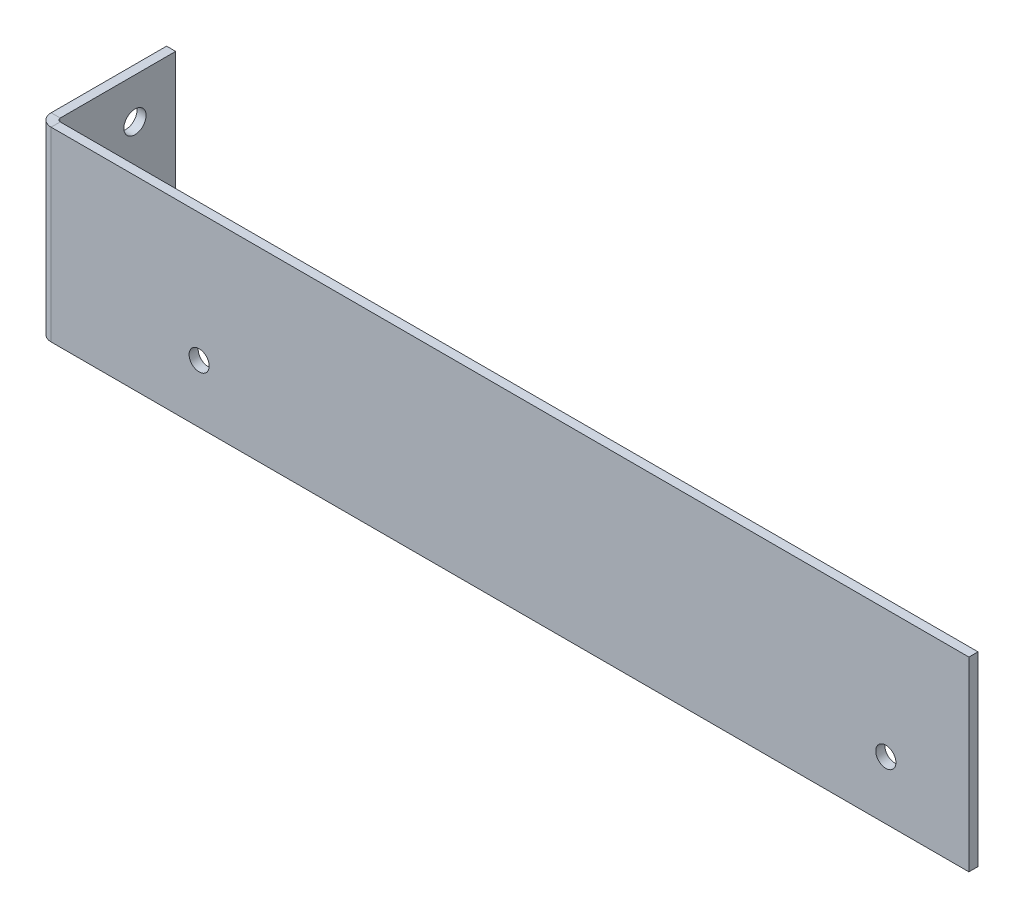
ISO-10303-21;
HEADER;
FILE_DESCRIPTION(('STEP AP214'),'2;1');
FILE_NAME('part.step','',(''),(''),'','','');
FILE_SCHEMA(('AUTOMOTIVE_DESIGN { 1 0 10303 214 1 1 1 1 }'));
ENDSEC;
DATA;
#1=APPLICATION_CONTEXT('core data for automotive mechanical design processes');
#2=APPLICATION_PROTOCOL_DEFINITION('international standard','automotive_design',2000,#1);
#3=PRODUCT_CONTEXT('',#1,'mechanical');
#4=PRODUCT('Part','Part','',(#3));
#5=PRODUCT_RELATED_PRODUCT_CATEGORY('part','',(#4));
#6=PRODUCT_DEFINITION_FORMATION('','',#4);
#7=PRODUCT_DEFINITION_CONTEXT('part definition',#1,'design');
#8=PRODUCT_DEFINITION('design','',#6,#7);
#9=PRODUCT_DEFINITION_SHAPE('','',#8);
#10=(LENGTH_UNIT() NAMED_UNIT(*) SI_UNIT(.MILLI.,.METRE.));
#11=(NAMED_UNIT(*) PLANE_ANGLE_UNIT() SI_UNIT($,.RADIAN.));
#12=(NAMED_UNIT(*) SI_UNIT($,.STERADIAN.) SOLID_ANGLE_UNIT());
#13=UNCERTAINTY_MEASURE_WITH_UNIT(LENGTH_MEASURE(1.E-05),#10,'distance_accuracy_value','');
#14=(GEOMETRIC_REPRESENTATION_CONTEXT(3) GLOBAL_UNCERTAINTY_ASSIGNED_CONTEXT((#13)) GLOBAL_UNIT_ASSIGNED_CONTEXT((#10,
#11,#12)) REPRESENTATION_CONTEXT('',''));
#15=CARTESIAN_POINT('',(0.,0.,0.));
#16=DIRECTION('',(0.,0.,1.));
#17=DIRECTION('',(1.,0.,0.));
#18=AXIS2_PLACEMENT_3D('',#15,#16,#17);
#19=CARTESIAN_POINT('',(203.2,12.7,-19.05));
#20=DIRECTION('',(-1.,0.,0.));
#21=DIRECTION('',(0.,0.,1.));
#22=AXIS2_PLACEMENT_3D('',#19,#20,#21);
#23=CYLINDRICAL_SURFACE('',#22,2.4257);
#24=CARTESIAN_POINT('',(0.,12.7,-19.05));
#25=DIRECTION('',(-1.,0.,0.));
#26=DIRECTION('',(0.,0.,1.));
#27=AXIS2_PLACEMENT_3D('',#24,#25,#26);
#28=CIRCLE('',#27,2.4257);
#29=CARTESIAN_POINT('',(0.,12.7,-16.6243));
#30=VERTEX_POINT('',#29);
#31=EDGE_CURVE('E155',#30,#30,#28,.T.);
#32=ORIENTED_EDGE('',*,*,#31,.T.);
#33=EDGE_LOOP('',(#32));
#34=FACE_BOUND('',#33,.T.);
#35=CARTESIAN_POINT('',(1.98374000000001,12.7,-19.05));
#36=DIRECTION('',(-1.,0.,0.));
#37=DIRECTION('',(0.,0.,1.));
#38=AXIS2_PLACEMENT_3D('',#35,#36,#37);
#39=CIRCLE('',#38,2.4257);
#40=CARTESIAN_POINT('',(1.98374000000001,12.7,-16.6243));
#41=VERTEX_POINT('',#40);
#42=EDGE_CURVE('E173',#41,#41,#39,.T.);
#43=ORIENTED_EDGE('',*,*,#42,.F.);
#44=EDGE_LOOP('',(#43));
#45=FACE_BOUND('',#44,.T.);
#46=ADVANCED_FACE('F38',(#34,#45),#23,.F.);
#47=CARTESIAN_POINT('',(203.2,31.75,-19.05));
#48=DIRECTION('',(-1.,0.,0.));
#49=DIRECTION('',(0.,0.,1.));
#50=AXIS2_PLACEMENT_3D('',#47,#48,#49);
#51=CYLINDRICAL_SURFACE('',#50,2.4257);
#52=CARTESIAN_POINT('',(0.,31.75,-19.05));
#53=DIRECTION('',(-1.,0.,0.));
#54=DIRECTION('',(0.,0.,1.));
#55=AXIS2_PLACEMENT_3D('',#52,#53,#54);
#56=CIRCLE('',#55,2.4257);
#57=CARTESIAN_POINT('',(0.,31.75,-16.6243));
#58=VERTEX_POINT('',#57);
#59=EDGE_CURVE('E153',#58,#58,#56,.T.);
#60=ORIENTED_EDGE('',*,*,#59,.T.);
#61=EDGE_LOOP('',(#60));
#62=FACE_BOUND('',#61,.T.);
#63=CARTESIAN_POINT('',(1.98374000000001,31.75,-19.05));
#64=DIRECTION('',(-1.,0.,0.));
#65=DIRECTION('',(0.,0.,1.));
#66=AXIS2_PLACEMENT_3D('',#63,#64,#65);
#67=CIRCLE('',#66,2.4257);
#68=CARTESIAN_POINT('',(1.98374000000001,31.75,-16.6243));
#69=VERTEX_POINT('',#68);
#70=EDGE_CURVE('E176',#69,#69,#67,.T.);
#71=ORIENTED_EDGE('',*,*,#70,.F.);
#72=EDGE_LOOP('',(#71));
#73=FACE_BOUND('',#72,.T.);
#74=ADVANCED_FACE('F252',(#62,#73),#51,.F.);
#75=CARTESIAN_POINT('',(95.6585772529698,40.64,-27.94));
#76=DIRECTION('',(0.,0.,-1.));
#77=DIRECTION('',(-1.,0.,0.));
#78=AXIS2_PLACEMENT_3D('',#75,#76,#77);
#79=PLANE('',#78);
#80=DIRECTION('',(0.,-1.,0.));
#81=VECTOR('',#80,1.);
#82=CARTESIAN_POINT('',(0.,40.64,-27.94));
#83=LINE('',#82,#81);
#84=CARTESIAN_POINT('',(0.,40.64,-27.94));
#85=VERTEX_POINT('',#84);
#86=CARTESIAN_POINT('',(0.,0.,-27.94));
#87=VERTEX_POINT('',#86);
#88=EDGE_CURVE('E129',#85,#87,#83,.T.);
#89=ORIENTED_EDGE('',*,*,#88,.F.);
#90=DIRECTION('',(-1.,0.,0.));
#91=VECTOR('',#90,1.);
#92=CARTESIAN_POINT('',(95.6585772529698,40.64,-27.94));
#93=LINE('',#92,#91);
#94=CARTESIAN_POINT('',(1.98374,40.64,-27.94));
#95=VERTEX_POINT('',#94);
#96=EDGE_CURVE('E57',#95,#85,#93,.T.);
#97=ORIENTED_EDGE('',*,*,#96,.F.);
#98=DIRECTION('',(0.,-1.,0.));
#99=VECTOR('',#98,1.);
#100=CARTESIAN_POINT('',(1.98374,40.64,-27.94));
#101=LINE('',#100,#99);
#102=CARTESIAN_POINT('',(1.98374,0.,-27.94));
#103=VERTEX_POINT('',#102);
#104=EDGE_CURVE('E77',#95,#103,#101,.T.);
#105=ORIENTED_EDGE('',*,*,#104,.T.);
#106=DIRECTION('',(-1.,0.,0.));
#107=VECTOR('',#106,1.);
#108=CARTESIAN_POINT('',(95.6585772529698,0.,-27.94));
#109=LINE('',#108,#107);
#110=EDGE_CURVE('E144',#103,#87,#109,.T.);
#111=ORIENTED_EDGE('',*,*,#110,.T.);
#112=EDGE_LOOP('',(#89,#97,#105,#111));
#113=FACE_BOUND('',#112,.T.);
#114=ADVANCED_FACE('F257',(#113),#79,.T.);
#115=CARTESIAN_POINT('',(95.6585772529698,0.,-27.94));
#116=DIRECTION('',(0.,1.,0.));
#117=DIRECTION('',(-1.,0.,0.));
#118=AXIS2_PLACEMENT_3D('',#115,#116,#117);
#119=PLANE('',#118);
#120=DIRECTION('',(-1.,0.,0.));
#121=VECTOR('',#120,1.);
#122=CARTESIAN_POINT('',(95.6585772529698,0.,-2.72034000000001));
#123=LINE('',#122,#121);
#124=CARTESIAN_POINT('',(1.98374,0.,-2.72034));
#125=VERTEX_POINT('',#124);
#126=CARTESIAN_POINT('',(0.,0.,-2.72034));
#127=VERTEX_POINT('',#126);
#128=EDGE_CURVE('E135',#125,#127,#123,.T.);
#129=ORIENTED_EDGE('',*,*,#128,.T.);
#130=DIRECTION('',(0.,0.,1.));
#131=VECTOR('',#130,1.);
#132=CARTESIAN_POINT('',(0.,0.,0.));
#133=LINE('',#132,#131);
#134=EDGE_CURVE('E72',#87,#127,#133,.T.);
#135=ORIENTED_EDGE('',*,*,#134,.F.);
#136=ORIENTED_EDGE('',*,*,#110,.F.);
#137=DIRECTION('',(0.,0.,-1.));
#138=VECTOR('',#137,1.);
#139=CARTESIAN_POINT('',(1.98374,0.,-27.94));
#140=LINE('',#139,#138);
#141=EDGE_CURVE('E11',#125,#103,#140,.T.);
#142=ORIENTED_EDGE('',*,*,#141,.F.);
#143=EDGE_LOOP('',(#129,#135,#136,#142));
#144=FACE_BOUND('',#143,.T.);
#145=ADVANCED_FACE('F142',(#144),#119,.F.);
#146=CARTESIAN_POINT('',(0.,40.64,0.));
#147=DIRECTION('',(1.,0.,0.));
#148=DIRECTION('',(0.,0.,-1.));
#149=AXIS2_PLACEMENT_3D('',#146,#147,#148);
#150=PLANE('',#149);
#151=ORIENTED_EDGE('',*,*,#59,.F.);
#152=EDGE_LOOP('',(#151));
#153=FACE_BOUND('',#152,.T.);
#154=ORIENTED_EDGE('',*,*,#31,.F.);
#155=EDGE_LOOP('',(#154));
#156=FACE_BOUND('',#155,.T.);
#157=ORIENTED_EDGE('',*,*,#134,.T.);
#158=DIRECTION('',(0.,1.,0.));
#159=VECTOR('',#158,1.);
#160=CARTESIAN_POINT('',(0.,0.,-2.72034));
#161=LINE('',#160,#159);
#162=CARTESIAN_POINT('',(0.,40.64,-2.72034));
#163=VERTEX_POINT('',#162);
#164=EDGE_CURVE('E119',#127,#163,#161,.T.);
#165=ORIENTED_EDGE('',*,*,#164,.T.);
#166=DIRECTION('',(0.,0.,1.));
#167=VECTOR('',#166,1.);
#168=CARTESIAN_POINT('',(0.,40.64,0.));
#169=LINE('',#168,#167);
#170=EDGE_CURVE('E180',#85,#163,#169,.T.);
#171=ORIENTED_EDGE('',*,*,#170,.F.);
#172=ORIENTED_EDGE('',*,*,#88,.T.);
#173=EDGE_LOOP('',(#157,#165,#171,#172));
#174=FACE_BOUND('',#173,.T.);
#175=ADVANCED_FACE('F147',(#153,#156,#174),#150,.F.);
#176=CARTESIAN_POINT('',(95.6585772529698,40.64,-27.94));
#177=DIRECTION('',(0.,1.,0.));
#178=DIRECTION('',(-1.,0.,0.));
#179=AXIS2_PLACEMENT_3D('',#176,#177,#178);
#180=PLANE('',#179);
#181=ORIENTED_EDGE('',*,*,#170,.T.);
#182=DIRECTION('',(-1.,0.,0.));
#183=VECTOR('',#182,1.);
#184=CARTESIAN_POINT('',(95.6585772529698,40.64,-2.72034000000001));
#185=LINE('',#184,#183);
#186=CARTESIAN_POINT('',(1.98374,40.64,-2.72034));
#187=VERTEX_POINT('',#186);
#188=EDGE_CURVE('E42',#187,#163,#185,.T.);
#189=ORIENTED_EDGE('',*,*,#188,.F.);
#190=DIRECTION('',(0.,0.,1.));
#191=VECTOR('',#190,1.);
#192=CARTESIAN_POINT('',(1.98374,40.64,-27.94));
#193=LINE('',#192,#191);
#194=EDGE_CURVE('E170',#95,#187,#193,.T.);
#195=ORIENTED_EDGE('',*,*,#194,.F.);
#196=ORIENTED_EDGE('',*,*,#96,.T.);
#197=EDGE_LOOP('',(#181,#189,#195,#196));
#198=FACE_BOUND('',#197,.T.);
#199=ADVANCED_FACE('F181',(#198),#180,.T.);
#200=CARTESIAN_POINT('',(1.98374,40.64,-27.94));
#201=DIRECTION('',(-1.,0.,0.));
#202=DIRECTION('',(0.,0.,1.));
#203=AXIS2_PLACEMENT_3D('',#200,#201,#202);
#204=PLANE('',#203);
#205=ORIENTED_EDGE('',*,*,#70,.T.);
#206=EDGE_LOOP('',(#205));
#207=FACE_BOUND('',#206,.T.);
#208=ORIENTED_EDGE('',*,*,#42,.T.);
#209=EDGE_LOOP('',(#208));
#210=FACE_BOUND('',#209,.T.);
#211=ORIENTED_EDGE('',*,*,#194,.T.);
#212=DIRECTION('',(0.,-1.,0.));
#213=VECTOR('',#212,1.);
#214=CARTESIAN_POINT('',(1.98374,0.,-2.72034));
#215=LINE('',#214,#213);
#216=EDGE_CURVE('E48',#187,#125,#215,.T.);
#217=ORIENTED_EDGE('',*,*,#216,.T.);
#218=ORIENTED_EDGE('',*,*,#141,.T.);
#219=ORIENTED_EDGE('',*,*,#104,.F.);
#220=EDGE_LOOP('',(#211,#217,#218,#219));
#221=FACE_BOUND('',#220,.T.);
#222=ADVANCED_FACE('F40',(#207,#210,#221),#204,.F.);
#223=CARTESIAN_POINT('',(203.2,40.64,0.));
#224=DIRECTION('',(0.,0.,-1.));
#225=DIRECTION('',(-1.,0.,0.));
#226=AXIS2_PLACEMENT_3D('',#223,#224,#225);
#227=PLANE('',#226);
#228=CARTESIAN_POINT('',(35.052,12.7,0.));
#229=DIRECTION('',(0.,0.,1.));
#230=DIRECTION('',(1.,0.,0.));
#231=AXIS2_PLACEMENT_3D('',#228,#229,#230);
#232=CIRCLE('',#231,2.1971);
#233=CARTESIAN_POINT('',(37.2491,12.7,0.));
#234=VERTEX_POINT('',#233);
#235=EDGE_CURVE('E208',#234,#234,#232,.T.);
#236=ORIENTED_EDGE('',*,*,#235,.F.);
#237=EDGE_LOOP('',(#236));
#238=FACE_BOUND('',#237,.T.);
#239=CARTESIAN_POINT('',(185.052,12.7,0.));
#240=DIRECTION('',(0.,0.,1.));
#241=DIRECTION('',(1.,0.,0.));
#242=AXIS2_PLACEMENT_3D('',#239,#240,#241);
#243=CIRCLE('',#242,2.1971);
#244=CARTESIAN_POINT('',(187.2491,12.7,0.));
#245=VERTEX_POINT('',#244);
#246=EDGE_CURVE('E205',#245,#245,#243,.T.);
#247=ORIENTED_EDGE('',*,*,#246,.F.);
#248=EDGE_LOOP('',(#247));
#249=FACE_BOUND('',#248,.T.);
#250=DIRECTION('',(0.,1.,0.));
#251=VECTOR('',#250,1.);
#252=CARTESIAN_POINT('',(2.72034,0.,0.));
#253=LINE('',#252,#251);
#254=CARTESIAN_POINT('',(2.72034000000002,0.,0.));
#255=VERTEX_POINT('',#254);
#256=CARTESIAN_POINT('',(2.72034000000002,40.64,0.));
#257=VERTEX_POINT('',#256);
#258=EDGE_CURVE('E219',#255,#257,#253,.T.);
#259=ORIENTED_EDGE('',*,*,#258,.F.);
#260=DIRECTION('',(1.,0.,0.));
#261=VECTOR('',#260,1.);
#262=CARTESIAN_POINT('',(203.2,0.,0.));
#263=LINE('',#262,#261);
#264=CARTESIAN_POINT('',(203.2,0.,0.));
#265=VERTEX_POINT('',#264);
#266=EDGE_CURVE('E92',#255,#265,#263,.T.);
#267=ORIENTED_EDGE('',*,*,#266,.T.);
#268=DIRECTION('',(0.,-1.,0.));
#269=VECTOR('',#268,1.);
#270=CARTESIAN_POINT('',(203.2,40.64,0.));
#271=LINE('',#270,#269);
#272=CARTESIAN_POINT('',(203.2,40.64,0.));
#273=VERTEX_POINT('',#272);
#274=EDGE_CURVE('E212',#273,#265,#271,.T.);
#275=ORIENTED_EDGE('',*,*,#274,.F.);
#276=DIRECTION('',(1.,0.,0.));
#277=VECTOR('',#276,1.);
#278=CARTESIAN_POINT('',(203.2,40.64,0.));
#279=LINE('',#278,#277);
#280=EDGE_CURVE('E214',#257,#273,#279,.T.);
#281=ORIENTED_EDGE('',*,*,#280,.F.);
#282=EDGE_LOOP('',(#259,#267,#275,#281));
#283=FACE_BOUND('',#282,.T.);
#284=ADVANCED_FACE('F230',(#238,#249,#283),#227,.F.);
#285=CARTESIAN_POINT('',(1.98374,40.64,-1.98374));
#286=DIRECTION('',(0.,0.,1.));
#287=DIRECTION('',(1.,0.,0.));
#288=AXIS2_PLACEMENT_3D('',#285,#286,#287);
#289=PLANE('',#288);
#290=CARTESIAN_POINT('',(35.052,12.7,-1.98374));
#291=DIRECTION('',(0.,0.,1.));
#292=DIRECTION('',(1.,0.,0.));
#293=AXIS2_PLACEMENT_3D('',#290,#291,#292);
#294=CIRCLE('',#293,2.1971);
#295=CARTESIAN_POINT('',(37.2491,12.7,-1.98374));
#296=VERTEX_POINT('',#295);
#297=EDGE_CURVE('E197',#296,#296,#294,.T.);
#298=ORIENTED_EDGE('',*,*,#297,.T.);
#299=EDGE_LOOP('',(#298));
#300=FACE_BOUND('',#299,.T.);
#301=CARTESIAN_POINT('',(185.052,12.7,-1.98374));
#302=DIRECTION('',(0.,0.,1.));
#303=DIRECTION('',(1.,0.,0.));
#304=AXIS2_PLACEMENT_3D('',#301,#302,#303);
#305=CIRCLE('',#304,2.1971);
#306=CARTESIAN_POINT('',(187.2491,12.7,-1.98374));
#307=VERTEX_POINT('',#306);
#308=EDGE_CURVE('E194',#307,#307,#305,.T.);
#309=ORIENTED_EDGE('',*,*,#308,.T.);
#310=EDGE_LOOP('',(#309));
#311=FACE_BOUND('',#310,.T.);
#312=DIRECTION('',(0.,-1.,0.));
#313=VECTOR('',#312,1.);
#314=CARTESIAN_POINT('',(2.72034,0.,-1.98374000000001));
#315=LINE('',#314,#313);
#316=CARTESIAN_POINT('',(2.72034,40.64,-1.98374));
#317=VERTEX_POINT('',#316);
#318=CARTESIAN_POINT('',(2.72034,0.,-1.98374));
#319=VERTEX_POINT('',#318);
#320=EDGE_CURVE('E217',#317,#319,#315,.T.);
#321=ORIENTED_EDGE('',*,*,#320,.F.);
#322=DIRECTION('',(-1.,0.,0.));
#323=VECTOR('',#322,1.);
#324=CARTESIAN_POINT('',(1.98374,40.64,-1.98374));
#325=LINE('',#324,#323);
#326=CARTESIAN_POINT('',(203.2,40.64,-1.98374000000001));
#327=VERTEX_POINT('',#326);
#328=EDGE_CURVE('E84',#327,#317,#325,.T.);
#329=ORIENTED_EDGE('',*,*,#328,.F.);
#330=DIRECTION('',(0.,-1.,0.));
#331=VECTOR('',#330,1.);
#332=CARTESIAN_POINT('',(203.2,40.64,-1.98374));
#333=LINE('',#332,#331);
#334=CARTESIAN_POINT('',(203.2,0.,-1.98374));
#335=VERTEX_POINT('',#334);
#336=EDGE_CURVE('E203',#327,#335,#333,.T.);
#337=ORIENTED_EDGE('',*,*,#336,.T.);
#338=DIRECTION('',(-1.,0.,0.));
#339=VECTOR('',#338,1.);
#340=CARTESIAN_POINT('',(1.98374,0.,-1.98374));
#341=LINE('',#340,#339);
#342=EDGE_CURVE('E200',#335,#319,#341,.T.);
#343=ORIENTED_EDGE('',*,*,#342,.T.);
#344=EDGE_LOOP('',(#321,#329,#337,#343));
#345=FACE_BOUND('',#344,.T.);
#346=ADVANCED_FACE('F234',(#300,#311,#345),#289,.F.);
#347=CARTESIAN_POINT('',(35.052,12.7,-27.94));
#348=DIRECTION('',(0.,0.,1.));
#349=DIRECTION('',(1.,0.,0.));
#350=AXIS2_PLACEMENT_3D('',#347,#348,#349);
#351=CYLINDRICAL_SURFACE('',#350,2.1971);
#352=ORIENTED_EDGE('',*,*,#235,.T.);
#353=EDGE_LOOP('',(#352));
#354=FACE_BOUND('',#353,.T.);
#355=ORIENTED_EDGE('',*,*,#297,.F.);
#356=EDGE_LOOP('',(#355));
#357=FACE_BOUND('',#356,.T.);
#358=ADVANCED_FACE('F236',(#354,#357),#351,.F.);
#359=CARTESIAN_POINT('',(185.052,12.7,-27.94));
#360=DIRECTION('',(0.,0.,1.));
#361=DIRECTION('',(1.,0.,0.));
#362=AXIS2_PLACEMENT_3D('',#359,#360,#361);
#363=CYLINDRICAL_SURFACE('',#362,2.1971);
#364=ORIENTED_EDGE('',*,*,#246,.T.);
#365=EDGE_LOOP('',(#364));
#366=FACE_BOUND('',#365,.T.);
#367=ORIENTED_EDGE('',*,*,#308,.F.);
#368=EDGE_LOOP('',(#367));
#369=FACE_BOUND('',#368,.T.);
#370=ADVANCED_FACE('F243',(#366,#369),#363,.F.);
#371=CARTESIAN_POINT('',(1.98374,0.,-409.114671815693));
#372=DIRECTION('',(0.,1.,0.));
#373=DIRECTION('',(0.,0.,1.));
#374=AXIS2_PLACEMENT_3D('',#371,#372,#373);
#375=PLANE('',#374);
#376=DIRECTION('',(0.,0.,1.));
#377=VECTOR('',#376,1.);
#378=CARTESIAN_POINT('',(203.2,0.,-409.114671815693));
#379=LINE('',#378,#377);
#380=EDGE_CURVE('E221',#335,#265,#379,.T.);
#381=ORIENTED_EDGE('',*,*,#380,.T.);
#382=ORIENTED_EDGE('',*,*,#266,.F.);
#383=DIRECTION('',(0.,0.,1.));
#384=VECTOR('',#383,1.);
#385=CARTESIAN_POINT('',(2.72034,0.,-409.114671815693));
#386=LINE('',#385,#384);
#387=EDGE_CURVE('E138',#319,#255,#386,.T.);
#388=ORIENTED_EDGE('',*,*,#387,.F.);
#389=ORIENTED_EDGE('',*,*,#342,.F.);
#390=EDGE_LOOP('',(#381,#382,#388,#389));
#391=FACE_BOUND('',#390,.T.);
#392=ADVANCED_FACE('F232',(#391),#375,.F.);
#393=CARTESIAN_POINT('',(1.98374,40.64,-409.114671815693));
#394=DIRECTION('',(0.,1.,0.));
#395=DIRECTION('',(0.,0.,1.));
#396=AXIS2_PLACEMENT_3D('',#393,#394,#395);
#397=PLANE('',#396);
#398=ORIENTED_EDGE('',*,*,#280,.T.);
#399=DIRECTION('',(0.,0.,1.));
#400=VECTOR('',#399,1.);
#401=CARTESIAN_POINT('',(203.2,40.64,-409.114671815693));
#402=LINE('',#401,#400);
#403=EDGE_CURVE('E165',#327,#273,#402,.T.);
#404=ORIENTED_EDGE('',*,*,#403,.F.);
#405=ORIENTED_EDGE('',*,*,#328,.T.);
#406=DIRECTION('',(0.,0.,1.));
#407=VECTOR('',#406,1.);
#408=CARTESIAN_POINT('',(2.72034,40.64,-409.114671815693));
#409=LINE('',#408,#407);
#410=EDGE_CURVE('E162',#317,#257,#409,.T.);
#411=ORIENTED_EDGE('',*,*,#410,.T.);
#412=EDGE_LOOP('',(#398,#404,#405,#411));
#413=FACE_BOUND('',#412,.T.);
#414=ADVANCED_FACE('F229',(#413),#397,.T.);
#415=CARTESIAN_POINT('',(203.2,40.64,-409.114671815693));
#416=DIRECTION('',(-1.,0.,0.));
#417=DIRECTION('',(0.,0.,1.));
#418=AXIS2_PLACEMENT_3D('',#415,#416,#417);
#419=PLANE('',#418);
#420=ORIENTED_EDGE('',*,*,#403,.T.);
#421=ORIENTED_EDGE('',*,*,#274,.T.);
#422=ORIENTED_EDGE('',*,*,#380,.F.);
#423=ORIENTED_EDGE('',*,*,#336,.F.);
#424=EDGE_LOOP('',(#420,#421,#422,#423));
#425=FACE_BOUND('',#424,.T.);
#426=ADVANCED_FACE('F226',(#425),#419,.F.);
#427=CARTESIAN_POINT('',(2.72034,0.,-2.72034));
#428=DIRECTION('',(0.,-1.,0.));
#429=DIRECTION('',(0.,0.,-1.));
#430=AXIS2_PLACEMENT_3D('',#427,#428,#429);
#431=PLANE('',#430);
#432=ORIENTED_EDGE('',*,*,#128,.F.);
#433=CARTESIAN_POINT('',(2.72034,0.,-2.72034));
#434=DIRECTION('',(0.,1.,0.));
#435=DIRECTION('',(0.,0.,1.));
#436=AXIS2_PLACEMENT_3D('',#433,#434,#435);
#437=CIRCLE('',#436,0.7366);
#438=EDGE_CURVE('E187',#125,#319,#437,.T.);
#439=ORIENTED_EDGE('',*,*,#438,.T.);
#440=ORIENTED_EDGE('',*,*,#387,.T.);
#441=CARTESIAN_POINT('',(2.72034,0.,-2.72034));
#442=DIRECTION('',(0.,1.,0.));
#443=DIRECTION('',(0.,0.,1.));
#444=AXIS2_PLACEMENT_3D('',#441,#442,#443);
#445=CIRCLE('',#444,2.72034);
#446=EDGE_CURVE('E123',#127,#255,#445,.T.);
#447=ORIENTED_EDGE('',*,*,#446,.F.);
#448=EDGE_LOOP('',(#432,#439,#440,#447));
#449=FACE_BOUND('',#448,.T.);
#450=ADVANCED_FACE('F133',(#449),#431,.T.);
#451=CARTESIAN_POINT('',(2.72034,40.64,-2.72034));
#452=DIRECTION('',(0.,1.,0.));
#453=DIRECTION('',(0.,0.,1.));
#454=AXIS2_PLACEMENT_3D('',#451,#452,#453);
#455=PLANE('',#454);
#456=CARTESIAN_POINT('',(2.72034,40.64,-2.72034));
#457=DIRECTION('',(0.,1.,0.));
#458=DIRECTION('',(0.,0.,1.));
#459=AXIS2_PLACEMENT_3D('',#456,#457,#458);
#460=CIRCLE('',#459,0.7366);
#461=EDGE_CURVE('E139',#317,#187,#460,.F.);
#462=ORIENTED_EDGE('',*,*,#461,.T.);
#463=ORIENTED_EDGE('',*,*,#188,.T.);
#464=CARTESIAN_POINT('',(2.72034,40.64,-2.72034));
#465=DIRECTION('',(0.,1.,0.));
#466=DIRECTION('',(0.,0.,1.));
#467=AXIS2_PLACEMENT_3D('',#464,#465,#466);
#468=CIRCLE('',#467,2.72034);
#469=EDGE_CURVE('E125',#257,#163,#468,.F.);
#470=ORIENTED_EDGE('',*,*,#469,.F.);
#471=ORIENTED_EDGE('',*,*,#410,.F.);
#472=EDGE_LOOP('',(#462,#463,#470,#471));
#473=FACE_BOUND('',#472,.T.);
#474=ADVANCED_FACE('F189',(#473),#455,.T.);
#475=CARTESIAN_POINT('',(2.72034,-232.010086763801,-2.72034));
#476=DIRECTION('',(0.,1.,0.));
#477=DIRECTION('',(0.,0.,1.));
#478=AXIS2_PLACEMENT_3D('',#475,#476,#477);
#479=CYLINDRICAL_SURFACE('',#478,2.72034);
#480=ORIENTED_EDGE('',*,*,#258,.T.);
#481=ORIENTED_EDGE('',*,*,#469,.T.);
#482=ORIENTED_EDGE('',*,*,#164,.F.);
#483=ORIENTED_EDGE('',*,*,#446,.T.);
#484=EDGE_LOOP('',(#480,#481,#482,#483));
#485=FACE_BOUND('',#484,.T.);
#486=ADVANCED_FACE('F122',(#485),#479,.T.);
#487=CARTESIAN_POINT('',(2.72034,-232.010086763801,-2.72034));
#488=DIRECTION('',(0.,1.,0.));
#489=DIRECTION('',(0.,0.,1.));
#490=AXIS2_PLACEMENT_3D('',#487,#488,#489);
#491=CYLINDRICAL_SURFACE('',#490,0.7366);
#492=ORIENTED_EDGE('',*,*,#320,.T.);
#493=ORIENTED_EDGE('',*,*,#438,.F.);
#494=ORIENTED_EDGE('',*,*,#216,.F.);
#495=ORIENTED_EDGE('',*,*,#461,.F.);
#496=EDGE_LOOP('',(#492,#493,#494,#495));
#497=FACE_BOUND('',#496,.T.);
#498=ADVANCED_FACE('F186',(#497),#491,.F.);
#499=CLOSED_SHELL('',(#46,#74,#114,#145,#175,#199,#222,#284,#346,#358,#370,#392,#414,#426,#450,
#474,#486,#498));
#500=MANIFOLD_SOLID_BREP('B2',#499);
#501=ADVANCED_BREP_SHAPE_REPRESENTATION('',(#18,#500),#14);
#502=SHAPE_DEFINITION_REPRESENTATION(#9,#501);
ENDSEC;
END-ISO-10303-21;
